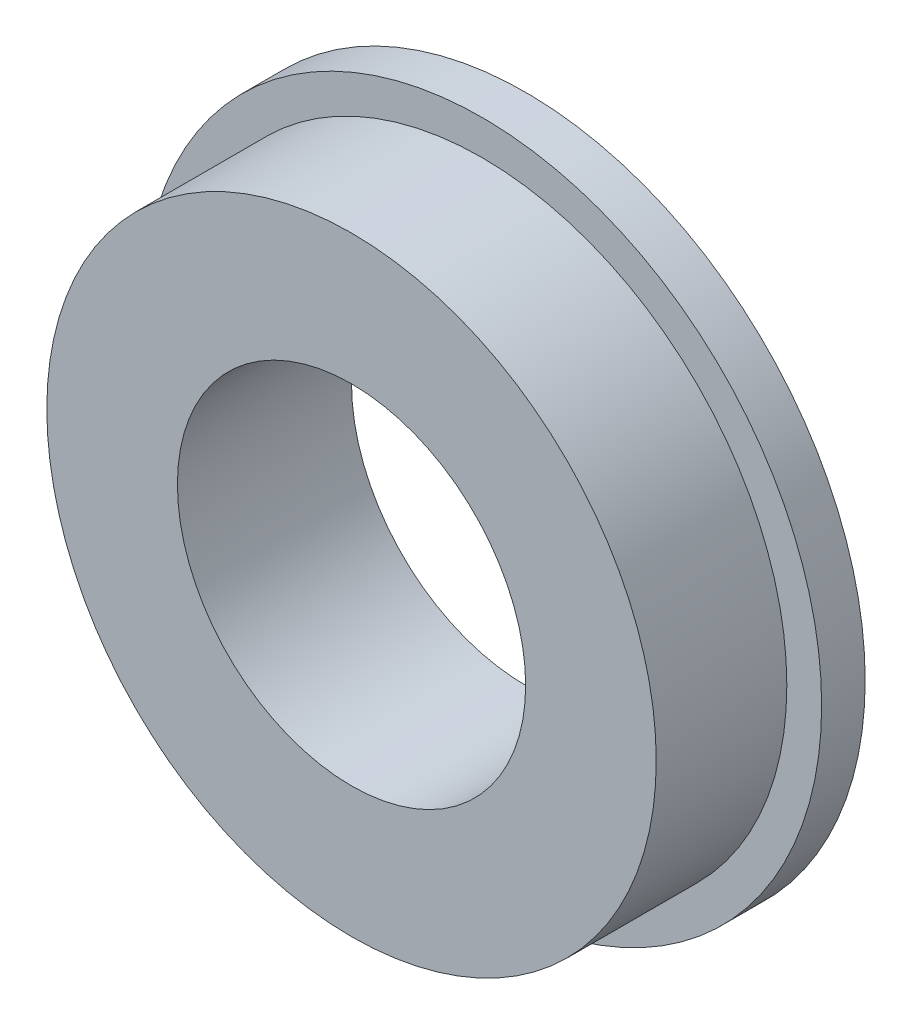
ISO-10303-21;
HEADER;
FILE_DESCRIPTION(('STEP AP214'),'2;1');
FILE_NAME('part.step','',(''),(''),'','','');
FILE_SCHEMA(('AUTOMOTIVE_DESIGN { 1 0 10303 214 1 1 1 1 }'));
ENDSEC;
DATA;
#1=APPLICATION_CONTEXT('core data for automotive mechanical design processes');
#2=APPLICATION_PROTOCOL_DEFINITION('international standard','automotive_design',2000,#1);
#3=PRODUCT_CONTEXT('',#1,'mechanical');
#4=PRODUCT('Part','Part','',(#3));
#5=PRODUCT_RELATED_PRODUCT_CATEGORY('part','',(#4));
#6=PRODUCT_DEFINITION_FORMATION('','',#4);
#7=PRODUCT_DEFINITION_CONTEXT('part definition',#1,'design');
#8=PRODUCT_DEFINITION('design','',#6,#7);
#9=PRODUCT_DEFINITION_SHAPE('','',#8);
#10=(LENGTH_UNIT() NAMED_UNIT(*) SI_UNIT(.MILLI.,.METRE.));
#11=(NAMED_UNIT(*) PLANE_ANGLE_UNIT() SI_UNIT($,.RADIAN.));
#12=(NAMED_UNIT(*) SI_UNIT($,.STERADIAN.) SOLID_ANGLE_UNIT());
#13=UNCERTAINTY_MEASURE_WITH_UNIT(LENGTH_MEASURE(1.E-05),#10,'distance_accuracy_value','');
#14=(GEOMETRIC_REPRESENTATION_CONTEXT(3) GLOBAL_UNCERTAINTY_ASSIGNED_CONTEXT((#13)) GLOBAL_UNIT_ASSIGNED_CONTEXT((#10,
#11,#12)) REPRESENTATION_CONTEXT('',''));
#15=CARTESIAN_POINT('',(0.,0.,0.));
#16=DIRECTION('',(0.,0.,1.));
#17=DIRECTION('',(1.,0.,0.));
#18=AXIS2_PLACEMENT_3D('',#15,#16,#17);
#19=CARTESIAN_POINT('',(0.,0.,1.));
#20=DIRECTION('',(0.,0.,-1.));
#21=DIRECTION('',(-1.,0.,0.));
#22=AXIS2_PLACEMENT_3D('',#19,#20,#21);
#23=CYLINDRICAL_SURFACE('',#22,7.8);
#24=CARTESIAN_POINT('',(0.,0.,1.));
#25=DIRECTION('',(0.,0.,1.));
#26=DIRECTION('',(1.,0.,0.));
#27=AXIS2_PLACEMENT_3D('',#24,#25,#26);
#28=CIRCLE('',#27,7.8);
#29=CARTESIAN_POINT('',(7.8,0.,1.));
#30=VERTEX_POINT('',#29);
#31=EDGE_CURVE('E41',#30,#30,#28,.T.);
#32=ORIENTED_EDGE('',*,*,#31,.F.);
#33=EDGE_LOOP('',(#32));
#34=FACE_BOUND('',#33,.T.);
#35=CARTESIAN_POINT('',(0.,0.,0.));
#36=DIRECTION('',(0.,0.,1.));
#37=DIRECTION('',(1.,0.,0.));
#38=AXIS2_PLACEMENT_3D('',#35,#36,#37);
#39=CIRCLE('',#38,7.8);
#40=CARTESIAN_POINT('',(7.8,0.,0.));
#41=VERTEX_POINT('',#40);
#42=EDGE_CURVE('E46',#41,#41,#39,.T.);
#43=ORIENTED_EDGE('',*,*,#42,.T.);
#44=EDGE_LOOP('',(#43));
#45=FACE_BOUND('',#44,.T.);
#46=ADVANCED_FACE('F34',(#34,#45),#23,.T.);
#47=CARTESIAN_POINT('',(0.,0.,1.));
#48=DIRECTION('',(0.,0.,1.));
#49=DIRECTION('',(1.,0.,0.));
#50=AXIS2_PLACEMENT_3D('',#47,#48,#49);
#51=PLANE('',#50);
#52=CARTESIAN_POINT('',(0.,0.,1.));
#53=DIRECTION('',(0.,0.,1.));
#54=DIRECTION('',(1.,0.,0.));
#55=AXIS2_PLACEMENT_3D('',#52,#53,#54);
#56=CIRCLE('',#55,7.);
#57=CARTESIAN_POINT('',(7.,0.,1.));
#58=VERTEX_POINT('',#57);
#59=EDGE_CURVE('E10',#58,#58,#56,.T.);
#60=ORIENTED_EDGE('',*,*,#59,.F.);
#61=EDGE_LOOP('',(#60));
#62=FACE_BOUND('',#61,.T.);
#63=ORIENTED_EDGE('',*,*,#31,.T.);
#64=EDGE_LOOP('',(#63));
#65=FACE_BOUND('',#64,.T.);
#66=ADVANCED_FACE('F70',(#62,#65),#51,.T.);
#67=CARTESIAN_POINT('',(0.,0.,0.));
#68=DIRECTION('',(0.,0.,1.));
#69=DIRECTION('',(1.,0.,0.));
#70=AXIS2_PLACEMENT_3D('',#67,#68,#69);
#71=PLANE('',#70);
#72=CARTESIAN_POINT('',(0.,0.,0.));
#73=DIRECTION('',(0.,0.,-1.));
#74=DIRECTION('',(-1.,0.,0.));
#75=AXIS2_PLACEMENT_3D('',#72,#73,#74);
#76=CIRCLE('',#75,4.);
#77=CARTESIAN_POINT('',(-4.,0.,0.));
#78=VERTEX_POINT('',#77);
#79=EDGE_CURVE('E58',#78,#78,#76,.T.);
#80=ORIENTED_EDGE('',*,*,#79,.F.);
#81=EDGE_LOOP('',(#80));
#82=FACE_BOUND('',#81,.T.);
#83=ORIENTED_EDGE('',*,*,#42,.F.);
#84=EDGE_LOOP('',(#83));
#85=FACE_BOUND('',#84,.T.);
#86=ADVANCED_FACE('F66',(#82,#85),#71,.F.);
#87=CARTESIAN_POINT('',(0.,0.,4.));
#88=DIRECTION('',(0.,0.,-1.));
#89=DIRECTION('',(-1.,0.,0.));
#90=AXIS2_PLACEMENT_3D('',#87,#88,#89);
#91=CYLINDRICAL_SURFACE('',#90,7.);
#92=CARTESIAN_POINT('',(0.,0.,4.));
#93=DIRECTION('',(0.,0.,1.));
#94=DIRECTION('',(1.,0.,0.));
#95=AXIS2_PLACEMENT_3D('',#92,#93,#94);
#96=CIRCLE('',#95,7.);
#97=CARTESIAN_POINT('',(7.,0.,4.));
#98=VERTEX_POINT('',#97);
#99=EDGE_CURVE('E49',#98,#98,#96,.T.);
#100=ORIENTED_EDGE('',*,*,#99,.F.);
#101=EDGE_LOOP('',(#100));
#102=FACE_BOUND('',#101,.T.);
#103=ORIENTED_EDGE('',*,*,#59,.T.);
#104=EDGE_LOOP('',(#103));
#105=FACE_BOUND('',#104,.T.);
#106=ADVANCED_FACE('F69',(#102,#105),#91,.T.);
#107=CARTESIAN_POINT('',(0.,0.,4.));
#108=DIRECTION('',(0.,0.,1.));
#109=DIRECTION('',(1.,0.,0.));
#110=AXIS2_PLACEMENT_3D('',#107,#108,#109);
#111=PLANE('',#110);
#112=CARTESIAN_POINT('',(0.,0.,4.));
#113=DIRECTION('',(0.,0.,1.));
#114=DIRECTION('',(1.,0.,0.));
#115=AXIS2_PLACEMENT_3D('',#112,#113,#114);
#116=CIRCLE('',#115,4.);
#117=CARTESIAN_POINT('',(4.,0.,4.));
#118=VERTEX_POINT('',#117);
#119=EDGE_CURVE('E37',#118,#118,#116,.T.);
#120=ORIENTED_EDGE('',*,*,#119,.F.);
#121=EDGE_LOOP('',(#120));
#122=FACE_BOUND('',#121,.T.);
#123=ORIENTED_EDGE('',*,*,#99,.T.);
#124=EDGE_LOOP('',(#123));
#125=FACE_BOUND('',#124,.T.);
#126=ADVANCED_FACE('F75',(#122,#125),#111,.T.);
#127=CARTESIAN_POINT('',(0.,0.,5.));
#128=DIRECTION('',(0.,0.,-1.));
#129=DIRECTION('',(-1.,0.,0.));
#130=AXIS2_PLACEMENT_3D('',#127,#128,#129);
#131=CYLINDRICAL_SURFACE('',#130,4.);
#132=ORIENTED_EDGE('',*,*,#119,.T.);
#133=EDGE_LOOP('',(#132));
#134=FACE_BOUND('',#133,.T.);
#135=ORIENTED_EDGE('',*,*,#79,.T.);
#136=EDGE_LOOP('',(#135));
#137=FACE_BOUND('',#136,.T.);
#138=ADVANCED_FACE('F64',(#134,#137),#131,.F.);
#139=CLOSED_SHELL('',(#46,#66,#86,#106,#126,#138));
#140=MANIFOLD_SOLID_BREP('B2',#139);
#141=ADVANCED_BREP_SHAPE_REPRESENTATION('',(#18,#140),#14);
#142=SHAPE_DEFINITION_REPRESENTATION(#9,#141);
ENDSEC;
END-ISO-10303-21;
